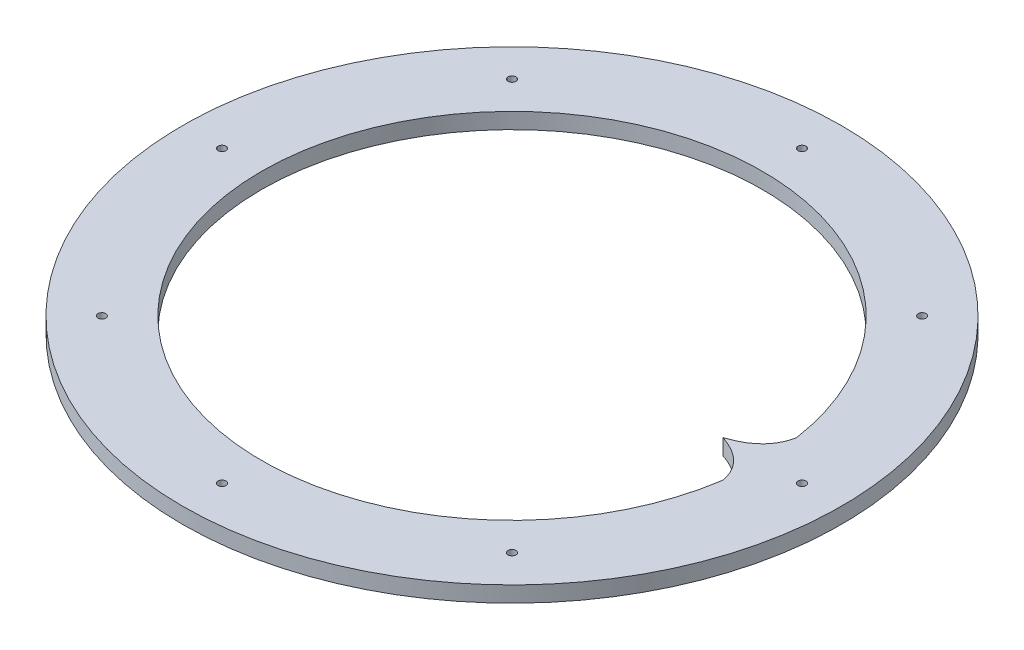
ISO-10303-21;
HEADER;
FILE_DESCRIPTION(('STEP AP214'),'2;1');
FILE_NAME('part.step','',(''),(''),'','','');
FILE_SCHEMA(('AUTOMOTIVE_DESIGN { 1 0 10303 214 1 1 1 1 }'));
ENDSEC;
DATA;
#1=APPLICATION_CONTEXT('core data for automotive mechanical design processes');
#2=APPLICATION_PROTOCOL_DEFINITION('international standard','automotive_design',2000,#1);
#3=PRODUCT_CONTEXT('',#1,'mechanical');
#4=PRODUCT('Part','Part','',(#3));
#5=PRODUCT_RELATED_PRODUCT_CATEGORY('part','',(#4));
#6=PRODUCT_DEFINITION_FORMATION('','',#4);
#7=PRODUCT_DEFINITION_CONTEXT('part definition',#1,'design');
#8=PRODUCT_DEFINITION('design','',#6,#7);
#9=PRODUCT_DEFINITION_SHAPE('','',#8);
#10=(LENGTH_UNIT() NAMED_UNIT(*) SI_UNIT(.MILLI.,.METRE.));
#11=(NAMED_UNIT(*) PLANE_ANGLE_UNIT() SI_UNIT($,.RADIAN.));
#12=(NAMED_UNIT(*) SI_UNIT($,.STERADIAN.) SOLID_ANGLE_UNIT());
#13=UNCERTAINTY_MEASURE_WITH_UNIT(LENGTH_MEASURE(1.E-05),#10,'distance_accuracy_value','');
#14=(GEOMETRIC_REPRESENTATION_CONTEXT(3) GLOBAL_UNCERTAINTY_ASSIGNED_CONTEXT((#13)) GLOBAL_UNIT_ASSIGNED_CONTEXT((#10,
#11,#12)) REPRESENTATION_CONTEXT('',''));
#15=CARTESIAN_POINT('',(0.,0.,0.));
#16=DIRECTION('',(0.,0.,1.));
#17=DIRECTION('',(1.,0.,0.));
#18=AXIS2_PLACEMENT_3D('',#15,#16,#17);
#19=CARTESIAN_POINT('',(0.,6.,0.));
#20=DIRECTION('',(0.,1.,0.));
#21=DIRECTION('',(0.,0.,1.));
#22=AXIS2_PLACEMENT_3D('',#19,#20,#21);
#23=PLANE('',#22);
#24=CARTESIAN_POINT('',(-110.,6.,0.));
#25=DIRECTION('',(0.,1.,0.));
#26=DIRECTION('',(0.,0.,-1.));
#27=AXIS2_PLACEMENT_3D('',#24,#25,#26);
#28=CIRCLE('',#27,1.5);
#29=CARTESIAN_POINT('',(-110.,6.,-1.5));
#30=VERTEX_POINT('',#29);
#31=EDGE_CURVE('E224',#30,#30,#28,.T.);
#32=ORIENTED_EDGE('',*,*,#31,.F.);
#33=EDGE_LOOP('',(#32));
#34=FACE_BOUND('',#33,.T.);
#35=CARTESIAN_POINT('',(0.,6.,-110.));
#36=DIRECTION('',(0.,1.,0.));
#37=DIRECTION('',(0.,0.,-1.));
#38=AXIS2_PLACEMENT_3D('',#35,#36,#37);
#39=CIRCLE('',#38,1.5);
#40=CARTESIAN_POINT('',(0.,6.,-111.5));
#41=VERTEX_POINT('',#40);
#42=EDGE_CURVE('E236',#41,#41,#39,.T.);
#43=ORIENTED_EDGE('',*,*,#42,.F.);
#44=EDGE_LOOP('',(#43));
#45=FACE_BOUND('',#44,.T.);
#46=CARTESIAN_POINT('',(110.,6.,0.));
#47=DIRECTION('',(0.,1.,0.));
#48=DIRECTION('',(0.,0.,1.));
#49=AXIS2_PLACEMENT_3D('',#46,#47,#48);
#50=CIRCLE('',#49,1.5);
#51=CARTESIAN_POINT('',(110.,6.,1.5));
#52=VERTEX_POINT('',#51);
#53=EDGE_CURVE('E248',#52,#52,#50,.T.);
#54=ORIENTED_EDGE('',*,*,#53,.F.);
#55=EDGE_LOOP('',(#54));
#56=FACE_BOUND('',#55,.T.);
#57=CARTESIAN_POINT('',(0.,6.,110.));
#58=DIRECTION('',(0.,1.,0.));
#59=DIRECTION('',(0.,0.,1.));
#60=AXIS2_PLACEMENT_3D('',#57,#58,#59);
#61=CIRCLE('',#60,1.5);
#62=CARTESIAN_POINT('',(0.,6.,111.5));
#63=VERTEX_POINT('',#62);
#64=EDGE_CURVE('E260',#63,#63,#61,.T.);
#65=ORIENTED_EDGE('',*,*,#64,.F.);
#66=EDGE_LOOP('',(#65));
#67=FACE_BOUND('',#66,.T.);
#68=CARTESIAN_POINT('',(0.,6.,0.));
#69=DIRECTION('',(0.,1.,0.));
#70=DIRECTION('',(0.,0.,1.));
#71=AXIS2_PLACEMENT_3D('',#68,#69,#70);
#72=CIRCLE('',#71,125.);
#73=CARTESIAN_POINT('',(0.,6.,125.));
#74=VERTEX_POINT('',#73);
#75=EDGE_CURVE('E11',#74,#74,#72,.T.);
#76=ORIENTED_EDGE('',*,*,#75,.T.);
#77=EDGE_LOOP('',(#76));
#78=FACE_BOUND('',#77,.T.);
#79=CARTESIAN_POINT('',(77.7817459305202,6.,77.7817459305202));
#80=DIRECTION('',(0.,1.,0.));
#81=DIRECTION('',(0.,0.,1.));
#82=AXIS2_PLACEMENT_3D('',#79,#80,#81);
#83=CIRCLE('',#82,1.5);
#84=CARTESIAN_POINT('',(77.7817459305202,6.,79.2817459305202));
#85=VERTEX_POINT('',#84);
#86=EDGE_CURVE('E254',#85,#85,#83,.T.);
#87=ORIENTED_EDGE('',*,*,#86,.F.);
#88=EDGE_LOOP('',(#87));
#89=FACE_BOUND('',#88,.T.);
#90=CARTESIAN_POINT('',(77.7817459305202,6.,-77.7817459305202));
#91=DIRECTION('',(0.,1.,0.));
#92=DIRECTION('',(0.,0.,1.));
#93=AXIS2_PLACEMENT_3D('',#90,#91,#92);
#94=CIRCLE('',#93,1.5);
#95=CARTESIAN_POINT('',(77.7817459305202,6.,-76.2817459305202));
#96=VERTEX_POINT('',#95);
#97=EDGE_CURVE('E242',#96,#96,#94,.T.);
#98=ORIENTED_EDGE('',*,*,#97,.F.);
#99=EDGE_LOOP('',(#98));
#100=FACE_BOUND('',#99,.T.);
#101=CARTESIAN_POINT('',(-77.7817459305202,6.,-77.7817459305202));
#102=DIRECTION('',(0.,1.,0.));
#103=DIRECTION('',(0.,0.,-1.));
#104=AXIS2_PLACEMENT_3D('',#101,#102,#103);
#105=CIRCLE('',#104,1.49999999999996);
#106=CARTESIAN_POINT('',(-77.7817459305202,6.,-79.2817459305202));
#107=VERTEX_POINT('',#106);
#108=EDGE_CURVE('E230',#107,#107,#105,.T.);
#109=ORIENTED_EDGE('',*,*,#108,.F.);
#110=EDGE_LOOP('',(#109));
#111=FACE_BOUND('',#110,.T.);
#112=CARTESIAN_POINT('',(-77.7817459305203,6.,77.7817459305203));
#113=DIRECTION('',(0.,1.,0.));
#114=DIRECTION('',(0.,0.,-1.));
#115=AXIS2_PLACEMENT_3D('',#112,#113,#114);
#116=CIRCLE('',#115,1.49999999999994);
#117=CARTESIAN_POINT('',(-77.7817459305203,6.,76.2817459305203));
#118=VERTEX_POINT('',#117);
#119=EDGE_CURVE('E218',#118,#118,#116,.T.);
#120=ORIENTED_EDGE('',*,*,#119,.F.);
#121=EDGE_LOOP('',(#120));
#122=FACE_BOUND('',#121,.T.);
#123=CARTESIAN_POINT('',(0.,6.,0.));
#124=DIRECTION('',(0.,1.,0.));
#125=DIRECTION('',(0.,0.,1.));
#126=AXIS2_PLACEMENT_3D('',#123,#124,#125);
#127=CIRCLE('',#126,95.);
#128=CARTESIAN_POINT('',(93.9765004691482,6.,-13.9074569771826));
#129=VERTEX_POINT('',#128);
#130=CARTESIAN_POINT('',(93.9765004691482,6.,13.9074569771826));
#131=VERTEX_POINT('',#130);
#132=EDGE_CURVE('E92',#129,#131,#127,.T.);
#133=ORIENTED_EDGE('',*,*,#132,.F.);
#134=CARTESIAN_POINT('',(79.9986510472224,6.,0.));
#135=CARTESIAN_POINT('',(92.0728014169836,6.,-3.95739434646483));
#136=CARTESIAN_POINT('',(93.9765004691482,6.,-13.9074569771826));
#137=B_SPLINE_CURVE_WITH_KNOTS('',2,(#134,#135,#136),.UNSPECIFIED.,.F.,.F.,(3,3),(0.,1.),.UNSPECIFIED.);
#138=CARTESIAN_POINT('',(79.9986510472224,6.,0.));
#139=VERTEX_POINT('',#138);
#140=EDGE_CURVE('E83',#139,#129,#137,.T.);
#141=ORIENTED_EDGE('',*,*,#140,.F.);
#142=CARTESIAN_POINT('',(93.9765004691482,6.,13.9074569771826));
#143=CARTESIAN_POINT('',(92.0728014169836,6.,3.95739434646483));
#144=CARTESIAN_POINT('',(79.9986510472224,6.,0.));
#145=B_SPLINE_CURVE_WITH_KNOTS('',2,(#142,#143,#144),.UNSPECIFIED.,.F.,.F.,(3,3),(0.,1.),.UNSPECIFIED.);
#146=EDGE_CURVE('E102',#131,#139,#145,.T.);
#147=ORIENTED_EDGE('',*,*,#146,.F.);
#148=EDGE_LOOP('',(#133,#141,#147));
#149=FACE_BOUND('',#148,.T.);
#150=ADVANCED_FACE('F47',(#34,#45,#56,#67,#78,#89,#100,#111,#122,#149),#23,.T.);
#151=CARTESIAN_POINT('',(0.,0.,0.));
#152=DIRECTION('',(0.,1.,0.));
#153=DIRECTION('',(0.,0.,1.));
#154=AXIS2_PLACEMENT_3D('',#151,#152,#153);
#155=PLANE('',#154);
#156=CARTESIAN_POINT('',(-77.7817459305203,0.,77.7817459305203));
#157=DIRECTION('',(0.,1.,0.));
#158=DIRECTION('',(0.,0.,-1.));
#159=AXIS2_PLACEMENT_3D('',#156,#157,#158);
#160=CIRCLE('',#159,1.49999999999994);
#161=CARTESIAN_POINT('',(-77.7817459305203,0.,76.2817459305203));
#162=VERTEX_POINT('',#161);
#163=EDGE_CURVE('E100',#162,#162,#160,.T.);
#164=ORIENTED_EDGE('',*,*,#163,.T.);
#165=EDGE_LOOP('',(#164));
#166=FACE_BOUND('',#165,.T.);
#167=CARTESIAN_POINT('',(-110.,0.,0.));
#168=DIRECTION('',(0.,1.,0.));
#169=DIRECTION('',(0.,0.,-1.));
#170=AXIS2_PLACEMENT_3D('',#167,#168,#169);
#171=CIRCLE('',#170,1.5);
#172=CARTESIAN_POINT('',(-110.,0.,-1.5));
#173=VERTEX_POINT('',#172);
#174=EDGE_CURVE('E175',#173,#173,#171,.T.);
#175=ORIENTED_EDGE('',*,*,#174,.T.);
#176=EDGE_LOOP('',(#175));
#177=FACE_BOUND('',#176,.T.);
#178=CARTESIAN_POINT('',(-77.7817459305202,0.,-77.7817459305202));
#179=DIRECTION('',(0.,1.,0.));
#180=DIRECTION('',(0.,0.,-1.));
#181=AXIS2_PLACEMENT_3D('',#178,#179,#180);
#182=CIRCLE('',#181,1.49999999999996);
#183=CARTESIAN_POINT('',(-77.7817459305202,0.,-79.2817459305202));
#184=VERTEX_POINT('',#183);
#185=EDGE_CURVE('E179',#184,#184,#182,.T.);
#186=ORIENTED_EDGE('',*,*,#185,.T.);
#187=EDGE_LOOP('',(#186));
#188=FACE_BOUND('',#187,.T.);
#189=CARTESIAN_POINT('',(0.,0.,-110.));
#190=DIRECTION('',(0.,1.,0.));
#191=DIRECTION('',(0.,0.,-1.));
#192=AXIS2_PLACEMENT_3D('',#189,#190,#191);
#193=CIRCLE('',#192,1.5);
#194=CARTESIAN_POINT('',(0.,0.,-111.5));
#195=VERTEX_POINT('',#194);
#196=EDGE_CURVE('E183',#195,#195,#193,.T.);
#197=ORIENTED_EDGE('',*,*,#196,.T.);
#198=EDGE_LOOP('',(#197));
#199=FACE_BOUND('',#198,.T.);
#200=CARTESIAN_POINT('',(77.7817459305202,0.,-77.7817459305202));
#201=DIRECTION('',(0.,1.,0.));
#202=DIRECTION('',(0.,0.,1.));
#203=AXIS2_PLACEMENT_3D('',#200,#201,#202);
#204=CIRCLE('',#203,1.5);
#205=CARTESIAN_POINT('',(77.7817459305202,0.,-76.2817459305202));
#206=VERTEX_POINT('',#205);
#207=EDGE_CURVE('E187',#206,#206,#204,.T.);
#208=ORIENTED_EDGE('',*,*,#207,.T.);
#209=EDGE_LOOP('',(#208));
#210=FACE_BOUND('',#209,.T.);
#211=CARTESIAN_POINT('',(110.,0.,0.));
#212=DIRECTION('',(0.,1.,0.));
#213=DIRECTION('',(0.,0.,1.));
#214=AXIS2_PLACEMENT_3D('',#211,#212,#213);
#215=CIRCLE('',#214,1.5);
#216=CARTESIAN_POINT('',(110.,0.,1.5));
#217=VERTEX_POINT('',#216);
#218=EDGE_CURVE('E191',#217,#217,#215,.T.);
#219=ORIENTED_EDGE('',*,*,#218,.T.);
#220=EDGE_LOOP('',(#219));
#221=FACE_BOUND('',#220,.T.);
#222=CARTESIAN_POINT('',(77.7817459305202,0.,77.7817459305202));
#223=DIRECTION('',(0.,1.,0.));
#224=DIRECTION('',(0.,0.,1.));
#225=AXIS2_PLACEMENT_3D('',#222,#223,#224);
#226=CIRCLE('',#225,1.5);
#227=CARTESIAN_POINT('',(77.7817459305202,0.,79.2817459305202));
#228=VERTEX_POINT('',#227);
#229=EDGE_CURVE('E195',#228,#228,#226,.T.);
#230=ORIENTED_EDGE('',*,*,#229,.T.);
#231=EDGE_LOOP('',(#230));
#232=FACE_BOUND('',#231,.T.);
#233=CARTESIAN_POINT('',(0.,0.,110.));
#234=DIRECTION('',(0.,1.,0.));
#235=DIRECTION('',(0.,0.,1.));
#236=AXIS2_PLACEMENT_3D('',#233,#234,#235);
#237=CIRCLE('',#236,1.5);
#238=CARTESIAN_POINT('',(0.,0.,111.5));
#239=VERTEX_POINT('',#238);
#240=EDGE_CURVE('E199',#239,#239,#237,.T.);
#241=ORIENTED_EDGE('',*,*,#240,.T.);
#242=EDGE_LOOP('',(#241));
#243=FACE_BOUND('',#242,.T.);
#244=CARTESIAN_POINT('',(0.,0.,0.));
#245=DIRECTION('',(0.,1.,0.));
#246=DIRECTION('',(0.,0.,1.));
#247=AXIS2_PLACEMENT_3D('',#244,#245,#246);
#248=CIRCLE('',#247,125.);
#249=CARTESIAN_POINT('',(0.,0.,125.));
#250=VERTEX_POINT('',#249);
#251=EDGE_CURVE('E51',#250,#250,#248,.T.);
#252=ORIENTED_EDGE('',*,*,#251,.F.);
#253=EDGE_LOOP('',(#252));
#254=FACE_BOUND('',#253,.T.);
#255=CARTESIAN_POINT('',(79.9986510472224,0.,0.));
#256=CARTESIAN_POINT('',(92.0728014169836,0.,-3.95739434646483));
#257=CARTESIAN_POINT('',(93.9765004691482,0.,-13.9074569771826));
#258=B_SPLINE_CURVE_WITH_KNOTS('',2,(#255,#256,#257),.UNSPECIFIED.,.F.,.F.,(3,3),(0.,1.),.UNSPECIFIED.);
#259=CARTESIAN_POINT('',(79.9986510472224,0.,0.));
#260=VERTEX_POINT('',#259);
#261=CARTESIAN_POINT('',(93.9765004691482,0.,-13.9074569771826));
#262=VERTEX_POINT('',#261);
#263=EDGE_CURVE('E71',#260,#262,#258,.T.);
#264=ORIENTED_EDGE('',*,*,#263,.T.);
#265=CARTESIAN_POINT('',(0.,0.,0.));
#266=DIRECTION('',(0.,1.,0.));
#267=DIRECTION('',(0.,0.,1.));
#268=AXIS2_PLACEMENT_3D('',#265,#266,#267);
#269=CIRCLE('',#268,95.);
#270=CARTESIAN_POINT('',(93.9765004691482,0.,13.9074569771826));
#271=VERTEX_POINT('',#270);
#272=EDGE_CURVE('E98',#262,#271,#269,.T.);
#273=ORIENTED_EDGE('',*,*,#272,.T.);
#274=CARTESIAN_POINT('',(93.9765004691482,0.,13.9074569771826));
#275=CARTESIAN_POINT('',(92.0728014169836,0.,3.95739434646483));
#276=CARTESIAN_POINT('',(79.9986510472224,0.,0.));
#277=B_SPLINE_CURVE_WITH_KNOTS('',2,(#274,#275,#276),.UNSPECIFIED.,.F.,.F.,(3,3),(0.,1.),.UNSPECIFIED.);
#278=EDGE_CURVE('E93',#271,#260,#277,.T.);
#279=ORIENTED_EDGE('',*,*,#278,.T.);
#280=EDGE_LOOP('',(#264,#273,#279));
#281=FACE_BOUND('',#280,.T.);
#282=ADVANCED_FACE('F161',(#166,#177,#188,#199,#210,#221,#232,#243,#254,#281),#155,.F.);
#283=CARTESIAN_POINT('',(0.,6.,0.));
#284=DIRECTION('',(0.,-1.,0.));
#285=DIRECTION('',(0.,0.,-1.));
#286=AXIS2_PLACEMENT_3D('',#283,#284,#285);
#287=CYLINDRICAL_SURFACE('',#286,125.);
#288=ORIENTED_EDGE('',*,*,#75,.F.);
#289=EDGE_LOOP('',(#288));
#290=FACE_BOUND('',#289,.T.);
#291=ORIENTED_EDGE('',*,*,#251,.T.);
#292=EDGE_LOOP('',(#291));
#293=FACE_BOUND('',#292,.T.);
#294=ADVANCED_FACE('F49',(#290,#293),#287,.T.);
#295=CARTESIAN_POINT('',(0.,6.,110.));
#296=DIRECTION('',(0.,-1.,0.));
#297=DIRECTION('',(0.,0.,-1.));
#298=AXIS2_PLACEMENT_3D('',#295,#296,#297);
#299=CYLINDRICAL_SURFACE('',#298,1.5);
#300=ORIENTED_EDGE('',*,*,#64,.T.);
#301=EDGE_LOOP('',(#300));
#302=FACE_BOUND('',#301,.T.);
#303=ORIENTED_EDGE('',*,*,#240,.F.);
#304=EDGE_LOOP('',(#303));
#305=FACE_BOUND('',#304,.T.);
#306=ADVANCED_FACE('F155',(#302,#305),#299,.F.);
#307=CARTESIAN_POINT('',(77.7817459305202,6.,77.7817459305202));
#308=DIRECTION('',(0.,-1.,0.));
#309=DIRECTION('',(0.,0.,-1.));
#310=AXIS2_PLACEMENT_3D('',#307,#308,#309);
#311=CYLINDRICAL_SURFACE('',#310,1.5);
#312=ORIENTED_EDGE('',*,*,#86,.T.);
#313=EDGE_LOOP('',(#312));
#314=FACE_BOUND('',#313,.T.);
#315=ORIENTED_EDGE('',*,*,#229,.F.);
#316=EDGE_LOOP('',(#315));
#317=FACE_BOUND('',#316,.T.);
#318=ADVANCED_FACE('F151',(#314,#317),#311,.F.);
#319=CARTESIAN_POINT('',(110.,6.,0.));
#320=DIRECTION('',(0.,-1.,0.));
#321=DIRECTION('',(0.,0.,-1.));
#322=AXIS2_PLACEMENT_3D('',#319,#320,#321);
#323=CYLINDRICAL_SURFACE('',#322,1.5);
#324=ORIENTED_EDGE('',*,*,#53,.T.);
#325=EDGE_LOOP('',(#324));
#326=FACE_BOUND('',#325,.T.);
#327=ORIENTED_EDGE('',*,*,#218,.F.);
#328=EDGE_LOOP('',(#327));
#329=FACE_BOUND('',#328,.T.);
#330=ADVANCED_FACE('F147',(#326,#329),#323,.F.);
#331=CARTESIAN_POINT('',(77.7817459305202,6.,-77.7817459305202));
#332=DIRECTION('',(0.,-1.,0.));
#333=DIRECTION('',(0.,0.,-1.));
#334=AXIS2_PLACEMENT_3D('',#331,#332,#333);
#335=CYLINDRICAL_SURFACE('',#334,1.5);
#336=ORIENTED_EDGE('',*,*,#97,.T.);
#337=EDGE_LOOP('',(#336));
#338=FACE_BOUND('',#337,.T.);
#339=ORIENTED_EDGE('',*,*,#207,.F.);
#340=EDGE_LOOP('',(#339));
#341=FACE_BOUND('',#340,.T.);
#342=ADVANCED_FACE('F143',(#338,#341),#335,.F.);
#343=CARTESIAN_POINT('',(0.,6.,-110.));
#344=DIRECTION('',(0.,-1.,0.));
#345=DIRECTION('',(0.,0.,-1.));
#346=AXIS2_PLACEMENT_3D('',#343,#344,#345);
#347=CYLINDRICAL_SURFACE('',#346,1.5);
#348=ORIENTED_EDGE('',*,*,#42,.T.);
#349=EDGE_LOOP('',(#348));
#350=FACE_BOUND('',#349,.T.);
#351=ORIENTED_EDGE('',*,*,#196,.F.);
#352=EDGE_LOOP('',(#351));
#353=FACE_BOUND('',#352,.T.);
#354=ADVANCED_FACE('F139',(#350,#353),#347,.F.);
#355=CARTESIAN_POINT('',(-77.7817459305202,6.,-77.7817459305202));
#356=DIRECTION('',(0.,-1.,0.));
#357=DIRECTION('',(0.,0.,-1.));
#358=AXIS2_PLACEMENT_3D('',#355,#356,#357);
#359=CYLINDRICAL_SURFACE('',#358,1.49999999999996);
#360=ORIENTED_EDGE('',*,*,#108,.T.);
#361=EDGE_LOOP('',(#360));
#362=FACE_BOUND('',#361,.T.);
#363=ORIENTED_EDGE('',*,*,#185,.F.);
#364=EDGE_LOOP('',(#363));
#365=FACE_BOUND('',#364,.T.);
#366=ADVANCED_FACE('F135',(#362,#365),#359,.F.);
#367=CARTESIAN_POINT('',(-110.,6.,0.));
#368=DIRECTION('',(0.,-1.,0.));
#369=DIRECTION('',(0.,0.,-1.));
#370=AXIS2_PLACEMENT_3D('',#367,#368,#369);
#371=CYLINDRICAL_SURFACE('',#370,1.5);
#372=ORIENTED_EDGE('',*,*,#31,.T.);
#373=EDGE_LOOP('',(#372));
#374=FACE_BOUND('',#373,.T.);
#375=ORIENTED_EDGE('',*,*,#174,.F.);
#376=EDGE_LOOP('',(#375));
#377=FACE_BOUND('',#376,.T.);
#378=ADVANCED_FACE('F131',(#374,#377),#371,.F.);
#379=CARTESIAN_POINT('',(-77.7817459305203,6.,77.7817459305203));
#380=DIRECTION('',(0.,-1.,0.));
#381=DIRECTION('',(0.,0.,-1.));
#382=AXIS2_PLACEMENT_3D('',#379,#380,#381);
#383=CYLINDRICAL_SURFACE('',#382,1.49999999999994);
#384=ORIENTED_EDGE('',*,*,#119,.T.);
#385=EDGE_LOOP('',(#384));
#386=FACE_BOUND('',#385,.T.);
#387=ORIENTED_EDGE('',*,*,#163,.F.);
#388=EDGE_LOOP('',(#387));
#389=FACE_BOUND('',#388,.T.);
#390=ADVANCED_FACE('F128',(#386,#389),#383,.F.);
#391=DIRECTION('',(0.,-1.,0.));
#392=VECTOR('',#391,1.);
#393=SURFACE_OF_LINEAR_EXTRUSION('',#137,#392);
#394=ORIENTED_EDGE('',*,*,#263,.F.);
#395=DIRECTION('',(0.,-1.,0.));
#396=VECTOR('',#395,1.);
#397=CARTESIAN_POINT('',(79.9986510472224,6.,0.));
#398=LINE('',#397,#396);
#399=EDGE_CURVE('E87',#139,#260,#398,.T.);
#400=ORIENTED_EDGE('',*,*,#399,.F.);
#401=ORIENTED_EDGE('',*,*,#140,.T.);
#402=DIRECTION('',(0.,-1.,0.));
#403=VECTOR('',#402,1.);
#404=CARTESIAN_POINT('',(93.9765004691482,6.,-13.9074569771826));
#405=LINE('',#404,#403);
#406=EDGE_CURVE('E86',#129,#262,#405,.T.);
#407=ORIENTED_EDGE('',*,*,#406,.T.);
#408=EDGE_LOOP('',(#394,#400,#401,#407));
#409=FACE_BOUND('',#408,.T.);
#410=ADVANCED_FACE('F85',(#409),#393,.T.);
#411=CARTESIAN_POINT('',(0.,6.,0.));
#412=DIRECTION('',(0.,-1.,0.));
#413=DIRECTION('',(0.,0.,-1.));
#414=AXIS2_PLACEMENT_3D('',#411,#412,#413);
#415=CYLINDRICAL_SURFACE('',#414,95.);
#416=ORIENTED_EDGE('',*,*,#272,.F.);
#417=ORIENTED_EDGE('',*,*,#406,.F.);
#418=ORIENTED_EDGE('',*,*,#132,.T.);
#419=DIRECTION('',(0.,-1.,0.));
#420=VECTOR('',#419,1.);
#421=CARTESIAN_POINT('',(93.9765004691482,6.,13.9074569771826));
#422=LINE('',#421,#420);
#423=EDGE_CURVE('E63',#131,#271,#422,.T.);
#424=ORIENTED_EDGE('',*,*,#423,.T.);
#425=EDGE_LOOP('',(#416,#417,#418,#424));
#426=FACE_BOUND('',#425,.T.);
#427=ADVANCED_FACE('F96',(#426),#415,.F.);
#428=DIRECTION('',(0.,-1.,0.));
#429=VECTOR('',#428,1.);
#430=SURFACE_OF_LINEAR_EXTRUSION('',#145,#429);
#431=ORIENTED_EDGE('',*,*,#278,.F.);
#432=ORIENTED_EDGE('',*,*,#423,.F.);
#433=ORIENTED_EDGE('',*,*,#146,.T.);
#434=ORIENTED_EDGE('',*,*,#399,.T.);
#435=EDGE_LOOP('',(#431,#432,#433,#434));
#436=FACE_BOUND('',#435,.T.);
#437=ADVANCED_FACE('F121',(#436),#430,.T.);
#438=CLOSED_SHELL('',(#150,#282,#294,#306,#318,#330,#342,#354,#366,#378,#390,#410,#427,#437));
#439=MANIFOLD_SOLID_BREP('B2',#438);
#440=ADVANCED_BREP_SHAPE_REPRESENTATION('',(#18,#439),#14);
#441=SHAPE_DEFINITION_REPRESENTATION(#9,#440);
ENDSEC;
END-ISO-10303-21;
